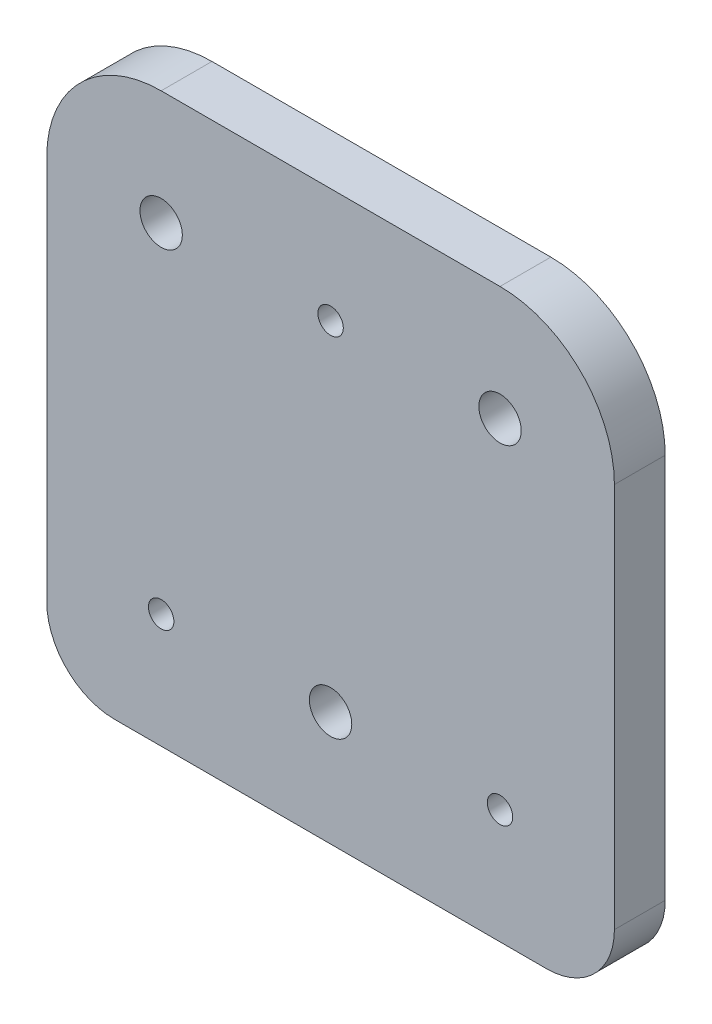
ISO-10303-21;
HEADER;
FILE_DESCRIPTION(('STEP AP214'),'2;1');
FILE_NAME('part.step','',(''),(''),'','','');
FILE_SCHEMA(('AUTOMOTIVE_DESIGN { 1 0 10303 214 1 1 1 1 }'));
ENDSEC;
DATA;
#1=APPLICATION_CONTEXT('core data for automotive mechanical design processes');
#2=APPLICATION_PROTOCOL_DEFINITION('international standard','automotive_design',2000,#1);
#3=PRODUCT_CONTEXT('',#1,'mechanical');
#4=PRODUCT('Part','Part','',(#3));
#5=PRODUCT_RELATED_PRODUCT_CATEGORY('part','',(#4));
#6=PRODUCT_DEFINITION_FORMATION('','',#4);
#7=PRODUCT_DEFINITION_CONTEXT('part definition',#1,'design');
#8=PRODUCT_DEFINITION('design','',#6,#7);
#9=PRODUCT_DEFINITION_SHAPE('','',#8);
#10=(LENGTH_UNIT() NAMED_UNIT(*) SI_UNIT(.MILLI.,.METRE.));
#11=(NAMED_UNIT(*) PLANE_ANGLE_UNIT() SI_UNIT($,.RADIAN.));
#12=(NAMED_UNIT(*) SI_UNIT($,.STERADIAN.) SOLID_ANGLE_UNIT());
#13=UNCERTAINTY_MEASURE_WITH_UNIT(LENGTH_MEASURE(1.E-05),#10,'distance_accuracy_value','');
#14=(GEOMETRIC_REPRESENTATION_CONTEXT(3) GLOBAL_UNCERTAINTY_ASSIGNED_CONTEXT((#13)) GLOBAL_UNIT_ASSIGNED_CONTEXT((#10,
#11,#12)) REPRESENTATION_CONTEXT('',''));
#15=CARTESIAN_POINT('',(0.,0.,0.));
#16=DIRECTION('',(0.,0.,1.));
#17=DIRECTION('',(1.,0.,0.));
#18=AXIS2_PLACEMENT_3D('',#15,#16,#17);
#19=CARTESIAN_POINT('',(20.,20.,6.));
#20=DIRECTION('',(0.,0.,1.));
#21=DIRECTION('',(1.,0.,0.));
#22=AXIS2_PLACEMENT_3D('',#19,#20,#21);
#23=PLANE('',#22);
#24=CARTESIAN_POINT('',(-20.,-20.,6.));
#25=DIRECTION('',(0.,0.,1.));
#26=DIRECTION('',(1.,0.,0.));
#27=AXIS2_PLACEMENT_3D('',#24,#25,#26);
#28=CIRCLE('',#27,1.5);
#29=CARTESIAN_POINT('',(-18.5,-20.,6.));
#30=VERTEX_POINT('',#29);
#31=EDGE_CURVE('E194',#30,#30,#28,.F.);
#32=ORIENTED_EDGE('',*,*,#31,.T.);
#33=EDGE_LOOP('',(#32));
#34=FACE_BOUND('',#33,.T.);
#35=CARTESIAN_POINT('',(20.,-20.,6.));
#36=DIRECTION('',(0.,0.,1.));
#37=DIRECTION('',(1.,0.,0.));
#38=AXIS2_PLACEMENT_3D('',#35,#36,#37);
#39=CIRCLE('',#38,1.5);
#40=CARTESIAN_POINT('',(21.5,-20.,6.));
#41=VERTEX_POINT('',#40);
#42=EDGE_CURVE('E204',#41,#41,#39,.F.);
#43=ORIENTED_EDGE('',*,*,#42,.T.);
#44=EDGE_LOOP('',(#43));
#45=FACE_BOUND('',#44,.T.);
#46=CARTESIAN_POINT('',(0.,20.,6.));
#47=DIRECTION('',(0.,0.,1.));
#48=DIRECTION('',(1.,0.,0.));
#49=AXIS2_PLACEMENT_3D('',#46,#47,#48);
#50=CIRCLE('',#49,1.5);
#51=CARTESIAN_POINT('',(1.5,20.,6.));
#52=VERTEX_POINT('',#51);
#53=EDGE_CURVE('E197',#52,#52,#50,.F.);
#54=ORIENTED_EDGE('',*,*,#53,.T.);
#55=EDGE_LOOP('',(#54));
#56=FACE_BOUND('',#55,.T.);
#57=DIRECTION('',(0.,-1.,0.));
#58=VECTOR('',#57,1.);
#59=CARTESIAN_POINT('',(-33.5,-20.,6.));
#60=LINE('',#59,#58);
#61=CARTESIAN_POINT('',(-33.5,20.,6.));
#62=VERTEX_POINT('',#61);
#63=CARTESIAN_POINT('',(-33.5,-25.5,6.));
#64=VERTEX_POINT('',#63);
#65=EDGE_CURVE('E142',#62,#64,#60,.T.);
#66=ORIENTED_EDGE('',*,*,#65,.T.);
#67=CARTESIAN_POINT('',(-25.5,-25.5,6.));
#68=DIRECTION('',(0.,0.,1.));
#69=DIRECTION('',(1.,0.,0.));
#70=AXIS2_PLACEMENT_3D('',#67,#68,#69);
#71=CIRCLE('',#70,8.);
#72=CARTESIAN_POINT('',(-25.5,-33.5,6.));
#73=VERTEX_POINT('',#72);
#74=EDGE_CURVE('E41',#64,#73,#71,.T.);
#75=ORIENTED_EDGE('',*,*,#74,.T.);
#76=DIRECTION('',(1.,0.,0.));
#77=VECTOR('',#76,1.);
#78=CARTESIAN_POINT('',(20.,-33.5,6.));
#79=LINE('',#78,#77);
#80=CARTESIAN_POINT('',(25.5,-33.5,6.));
#81=VERTEX_POINT('',#80);
#82=EDGE_CURVE('E141',#73,#81,#79,.T.);
#83=ORIENTED_EDGE('',*,*,#82,.T.);
#84=CARTESIAN_POINT('',(25.5,-25.5,6.));
#85=DIRECTION('',(0.,0.,1.));
#86=DIRECTION('',(1.,0.,0.));
#87=AXIS2_PLACEMENT_3D('',#84,#85,#86);
#88=CIRCLE('',#87,8.);
#89=CARTESIAN_POINT('',(33.5,-25.5,6.));
#90=VERTEX_POINT('',#89);
#91=EDGE_CURVE('E48',#81,#90,#88,.T.);
#92=ORIENTED_EDGE('',*,*,#91,.T.);
#93=DIRECTION('',(0.,1.,0.));
#94=VECTOR('',#93,1.);
#95=CARTESIAN_POINT('',(33.5,-20.,6.));
#96=LINE('',#95,#94);
#97=CARTESIAN_POINT('',(33.5,20.,6.));
#98=VERTEX_POINT('',#97);
#99=EDGE_CURVE('E115',#90,#98,#96,.T.);
#100=ORIENTED_EDGE('',*,*,#99,.T.);
#101=CARTESIAN_POINT('',(20.,20.,6.));
#102=DIRECTION('',(0.,0.,1.));
#103=DIRECTION('',(1.,0.,0.));
#104=AXIS2_PLACEMENT_3D('',#101,#102,#103);
#105=CIRCLE('',#104,13.5);
#106=CARTESIAN_POINT('',(20.,33.5,6.));
#107=VERTEX_POINT('',#106);
#108=EDGE_CURVE('E111',#98,#107,#105,.T.);
#109=ORIENTED_EDGE('',*,*,#108,.T.);
#110=DIRECTION('',(-1.,0.,0.));
#111=VECTOR('',#110,1.);
#112=CARTESIAN_POINT('',(-20.,33.5,6.));
#113=LINE('',#112,#111);
#114=CARTESIAN_POINT('',(-20.,33.5,6.));
#115=VERTEX_POINT('',#114);
#116=EDGE_CURVE('E101',#107,#115,#113,.T.);
#117=ORIENTED_EDGE('',*,*,#116,.T.);
#118=CARTESIAN_POINT('',(-20.,20.,6.));
#119=DIRECTION('',(0.,0.,1.));
#120=DIRECTION('',(1.,0.,0.));
#121=AXIS2_PLACEMENT_3D('',#118,#119,#120);
#122=CIRCLE('',#121,13.5);
#123=EDGE_CURVE('E110',#115,#62,#122,.T.);
#124=ORIENTED_EDGE('',*,*,#123,.T.);
#125=EDGE_LOOP('',(#66,#75,#83,#92,#100,#109,#117,#124));
#126=FACE_BOUND('',#125,.T.);
#127=CARTESIAN_POINT('',(20.,20.,6.));
#128=DIRECTION('',(0.,0.,1.));
#129=DIRECTION('',(1.,0.,0.));
#130=AXIS2_PLACEMENT_3D('',#127,#128,#129);
#131=CIRCLE('',#130,2.5);
#132=CARTESIAN_POINT('',(22.5,20.,6.));
#133=VERTEX_POINT('',#132);
#134=EDGE_CURVE('E182',#133,#133,#131,.T.);
#135=ORIENTED_EDGE('',*,*,#134,.F.);
#136=EDGE_LOOP('',(#135));
#137=FACE_BOUND('',#136,.T.);
#138=CARTESIAN_POINT('',(-20.,20.,6.));
#139=DIRECTION('',(0.,0.,1.));
#140=DIRECTION('',(1.,0.,0.));
#141=AXIS2_PLACEMENT_3D('',#138,#139,#140);
#142=CIRCLE('',#141,2.5);
#143=CARTESIAN_POINT('',(-17.5,20.,6.));
#144=VERTEX_POINT('',#143);
#145=EDGE_CURVE('E174',#144,#144,#142,.T.);
#146=ORIENTED_EDGE('',*,*,#145,.F.);
#147=EDGE_LOOP('',(#146));
#148=FACE_BOUND('',#147,.T.);
#149=CARTESIAN_POINT('',(0.,-20.,6.));
#150=DIRECTION('',(0.,0.,1.));
#151=DIRECTION('',(1.,0.,0.));
#152=AXIS2_PLACEMENT_3D('',#149,#150,#151);
#153=CIRCLE('',#152,2.5);
#154=CARTESIAN_POINT('',(2.5,-20.,6.));
#155=VERTEX_POINT('',#154);
#156=EDGE_CURVE('E188',#155,#155,#153,.T.);
#157=ORIENTED_EDGE('',*,*,#156,.F.);
#158=EDGE_LOOP('',(#157));
#159=FACE_BOUND('',#158,.T.);
#160=ADVANCED_FACE('F33',(#34,#45,#56,#126,#137,#148,#159),#23,.T.);
#161=CARTESIAN_POINT('',(20.,20.,0.));
#162=DIRECTION('',(0.,0.,1.));
#163=DIRECTION('',(1.,0.,0.));
#164=AXIS2_PLACEMENT_3D('',#161,#162,#163);
#165=PLANE('',#164);
#166=CARTESIAN_POINT('',(-20.,-20.,0.));
#167=DIRECTION('',(0.,0.,-1.));
#168=DIRECTION('',(-1.,0.,0.));
#169=AXIS2_PLACEMENT_3D('',#166,#167,#168);
#170=CIRCLE('',#169,1.5);
#171=CARTESIAN_POINT('',(-21.5,-20.,0.));
#172=VERTEX_POINT('',#171);
#173=EDGE_CURVE('E207',#172,#172,#170,.T.);
#174=ORIENTED_EDGE('',*,*,#173,.F.);
#175=EDGE_LOOP('',(#174));
#176=FACE_BOUND('',#175,.T.);
#177=CARTESIAN_POINT('',(20.,-20.,0.));
#178=DIRECTION('',(0.,0.,-1.));
#179=DIRECTION('',(-1.,0.,0.));
#180=AXIS2_PLACEMENT_3D('',#177,#178,#179);
#181=CIRCLE('',#180,1.5);
#182=CARTESIAN_POINT('',(18.5,-20.,0.));
#183=VERTEX_POINT('',#182);
#184=EDGE_CURVE('E200',#183,#183,#181,.T.);
#185=ORIENTED_EDGE('',*,*,#184,.F.);
#186=EDGE_LOOP('',(#185));
#187=FACE_BOUND('',#186,.T.);
#188=CARTESIAN_POINT('',(0.,20.,0.));
#189=DIRECTION('',(0.,0.,-1.));
#190=DIRECTION('',(-1.,0.,0.));
#191=AXIS2_PLACEMENT_3D('',#188,#189,#190);
#192=CIRCLE('',#191,1.5);
#193=CARTESIAN_POINT('',(-1.5,20.,0.));
#194=VERTEX_POINT('',#193);
#195=EDGE_CURVE('E201',#194,#194,#192,.T.);
#196=ORIENTED_EDGE('',*,*,#195,.F.);
#197=EDGE_LOOP('',(#196));
#198=FACE_BOUND('',#197,.T.);
#199=DIRECTION('',(1.,0.,0.));
#200=VECTOR('',#199,1.);
#201=CARTESIAN_POINT('',(20.,-33.5,0.));
#202=LINE('',#201,#200);
#203=CARTESIAN_POINT('',(-25.5,-33.5,0.));
#204=VERTEX_POINT('',#203);
#205=CARTESIAN_POINT('',(25.5,-33.5,0.));
#206=VERTEX_POINT('',#205);
#207=EDGE_CURVE('E158',#204,#206,#202,.T.);
#208=ORIENTED_EDGE('',*,*,#207,.F.);
#209=CARTESIAN_POINT('',(-25.5,-25.5,0.));
#210=DIRECTION('',(0.,0.,1.));
#211=DIRECTION('',(1.,0.,0.));
#212=AXIS2_PLACEMENT_3D('',#209,#210,#211);
#213=CIRCLE('',#212,8.);
#214=CARTESIAN_POINT('',(-33.5,-25.5,0.));
#215=VERTEX_POINT('',#214);
#216=EDGE_CURVE('E136',#204,#215,#213,.F.);
#217=ORIENTED_EDGE('',*,*,#216,.T.);
#218=DIRECTION('',(0.,-1.,0.));
#219=VECTOR('',#218,1.);
#220=CARTESIAN_POINT('',(-33.5,-20.,0.));
#221=LINE('',#220,#219);
#222=CARTESIAN_POINT('',(-33.5,20.,0.));
#223=VERTEX_POINT('',#222);
#224=EDGE_CURVE('E157',#223,#215,#221,.T.);
#225=ORIENTED_EDGE('',*,*,#224,.F.);
#226=CARTESIAN_POINT('',(-20.,20.,0.));
#227=DIRECTION('',(0.,0.,1.));
#228=DIRECTION('',(1.,0.,0.));
#229=AXIS2_PLACEMENT_3D('',#226,#227,#228);
#230=CIRCLE('',#229,13.5);
#231=CARTESIAN_POINT('',(-20.,33.5,0.));
#232=VERTEX_POINT('',#231);
#233=EDGE_CURVE('E162',#232,#223,#230,.T.);
#234=ORIENTED_EDGE('',*,*,#233,.F.);
#235=DIRECTION('',(-1.,0.,0.));
#236=VECTOR('',#235,1.);
#237=CARTESIAN_POINT('',(-20.,33.5,0.));
#238=LINE('',#237,#236);
#239=CARTESIAN_POINT('',(20.,33.5,0.));
#240=VERTEX_POINT('',#239);
#241=EDGE_CURVE('E165',#240,#232,#238,.T.);
#242=ORIENTED_EDGE('',*,*,#241,.F.);
#243=CARTESIAN_POINT('',(20.,20.,0.));
#244=DIRECTION('',(0.,0.,1.));
#245=DIRECTION('',(1.,0.,0.));
#246=AXIS2_PLACEMENT_3D('',#243,#244,#245);
#247=CIRCLE('',#246,13.5);
#248=CARTESIAN_POINT('',(33.5,20.,0.));
#249=VERTEX_POINT('',#248);
#250=EDGE_CURVE('E123',#249,#240,#247,.T.);
#251=ORIENTED_EDGE('',*,*,#250,.F.);
#252=DIRECTION('',(0.,1.,0.));
#253=VECTOR('',#252,1.);
#254=CARTESIAN_POINT('',(33.5,-20.,0.));
#255=LINE('',#254,#253);
#256=CARTESIAN_POINT('',(33.5,-25.5,0.));
#257=VERTEX_POINT('',#256);
#258=EDGE_CURVE('E119',#257,#249,#255,.T.);
#259=ORIENTED_EDGE('',*,*,#258,.F.);
#260=CARTESIAN_POINT('',(25.5,-25.5,0.));
#261=DIRECTION('',(0.,0.,1.));
#262=DIRECTION('',(1.,0.,0.));
#263=AXIS2_PLACEMENT_3D('',#260,#261,#262);
#264=CIRCLE('',#263,8.);
#265=EDGE_CURVE('E134',#257,#206,#264,.F.);
#266=ORIENTED_EDGE('',*,*,#265,.T.);
#267=EDGE_LOOP('',(#208,#217,#225,#234,#242,#251,#259,#266));
#268=FACE_BOUND('',#267,.T.);
#269=CARTESIAN_POINT('',(-20.,20.,0.));
#270=DIRECTION('',(0.,0.,1.));
#271=DIRECTION('',(1.,0.,0.));
#272=AXIS2_PLACEMENT_3D('',#269,#270,#271);
#273=CIRCLE('',#272,2.5);
#274=CARTESIAN_POINT('',(-17.5,20.,0.));
#275=VERTEX_POINT('',#274);
#276=EDGE_CURVE('E179',#275,#275,#273,.T.);
#277=ORIENTED_EDGE('',*,*,#276,.T.);
#278=EDGE_LOOP('',(#277));
#279=FACE_BOUND('',#278,.T.);
#280=CARTESIAN_POINT('',(20.,20.,0.));
#281=DIRECTION('',(0.,0.,1.));
#282=DIRECTION('',(1.,0.,0.));
#283=AXIS2_PLACEMENT_3D('',#280,#281,#282);
#284=CIRCLE('',#283,2.5);
#285=CARTESIAN_POINT('',(22.5,20.,0.));
#286=VERTEX_POINT('',#285);
#287=EDGE_CURVE('E185',#286,#286,#284,.T.);
#288=ORIENTED_EDGE('',*,*,#287,.T.);
#289=EDGE_LOOP('',(#288));
#290=FACE_BOUND('',#289,.T.);
#291=CARTESIAN_POINT('',(0.,-20.,0.));
#292=DIRECTION('',(0.,0.,1.));
#293=DIRECTION('',(1.,0.,0.));
#294=AXIS2_PLACEMENT_3D('',#291,#292,#293);
#295=CIRCLE('',#294,2.5);
#296=CARTESIAN_POINT('',(2.5,-20.,0.));
#297=VERTEX_POINT('',#296);
#298=EDGE_CURVE('E191',#297,#297,#295,.T.);
#299=ORIENTED_EDGE('',*,*,#298,.T.);
#300=EDGE_LOOP('',(#299));
#301=FACE_BOUND('',#300,.T.);
#302=ADVANCED_FACE('F154',(#176,#187,#198,#268,#279,#290,#301),#165,.F.);
#303=CARTESIAN_POINT('',(20.,20.,6.));
#304=DIRECTION('',(0.,0.,-1.));
#305=DIRECTION('',(-1.,0.,0.));
#306=AXIS2_PLACEMENT_3D('',#303,#304,#305);
#307=CYLINDRICAL_SURFACE('',#306,13.5);
#308=ORIENTED_EDGE('',*,*,#250,.T.);
#309=DIRECTION('',(0.,0.,-1.));
#310=VECTOR('',#309,1.);
#311=CARTESIAN_POINT('',(20.,33.5,6.));
#312=LINE('',#311,#310);
#313=EDGE_CURVE('E105',#107,#240,#312,.T.);
#314=ORIENTED_EDGE('',*,*,#313,.F.);
#315=ORIENTED_EDGE('',*,*,#108,.F.);
#316=DIRECTION('',(0.,0.,-1.));
#317=VECTOR('',#316,1.);
#318=CARTESIAN_POINT('',(33.5,20.,6.));
#319=LINE('',#318,#317);
#320=EDGE_CURVE('E170',#98,#249,#319,.T.);
#321=ORIENTED_EDGE('',*,*,#320,.T.);
#322=EDGE_LOOP('',(#308,#314,#315,#321));
#323=FACE_BOUND('',#322,.T.);
#324=ADVANCED_FACE('F121',(#323),#307,.T.);
#325=CARTESIAN_POINT('',(-20.,33.5,6.));
#326=DIRECTION('',(0.,-1.,0.));
#327=DIRECTION('',(1.,0.,0.));
#328=AXIS2_PLACEMENT_3D('',#325,#326,#327);
#329=PLANE('',#328);
#330=ORIENTED_EDGE('',*,*,#241,.T.);
#331=DIRECTION('',(0.,0.,-1.));
#332=VECTOR('',#331,1.);
#333=CARTESIAN_POINT('',(-20.,33.5,6.));
#334=LINE('',#333,#332);
#335=EDGE_CURVE('E108',#115,#232,#334,.T.);
#336=ORIENTED_EDGE('',*,*,#335,.F.);
#337=ORIENTED_EDGE('',*,*,#116,.F.);
#338=ORIENTED_EDGE('',*,*,#313,.T.);
#339=EDGE_LOOP('',(#330,#336,#337,#338));
#340=FACE_BOUND('',#339,.T.);
#341=ADVANCED_FACE('F103',(#340),#329,.F.);
#342=CARTESIAN_POINT('',(-20.,20.,6.));
#343=DIRECTION('',(0.,0.,-1.));
#344=DIRECTION('',(-1.,0.,0.));
#345=AXIS2_PLACEMENT_3D('',#342,#343,#344);
#346=CYLINDRICAL_SURFACE('',#345,13.5);
#347=ORIENTED_EDGE('',*,*,#233,.T.);
#348=DIRECTION('',(0.,0.,-1.));
#349=VECTOR('',#348,1.);
#350=CARTESIAN_POINT('',(-33.5,20.,6.));
#351=LINE('',#350,#349);
#352=EDGE_CURVE('E128',#62,#223,#351,.T.);
#353=ORIENTED_EDGE('',*,*,#352,.F.);
#354=ORIENTED_EDGE('',*,*,#123,.F.);
#355=ORIENTED_EDGE('',*,*,#335,.T.);
#356=EDGE_LOOP('',(#347,#353,#354,#355));
#357=FACE_BOUND('',#356,.T.);
#358=ADVANCED_FACE('F176',(#357),#346,.T.);
#359=CARTESIAN_POINT('',(-33.5,-20.,6.));
#360=DIRECTION('',(1.,0.,0.));
#361=DIRECTION('',(0.,0.,-1.));
#362=AXIS2_PLACEMENT_3D('',#359,#360,#361);
#363=PLANE('',#362);
#364=ORIENTED_EDGE('',*,*,#224,.T.);
#365=DIRECTION('',(0.,0.,-1.));
#366=VECTOR('',#365,1.);
#367=CARTESIAN_POINT('',(-33.5,-25.5,6.));
#368=LINE('',#367,#366);
#369=EDGE_CURVE('E56',#215,#64,#368,.F.);
#370=ORIENTED_EDGE('',*,*,#369,.T.);
#371=ORIENTED_EDGE('',*,*,#65,.F.);
#372=ORIENTED_EDGE('',*,*,#352,.T.);
#373=EDGE_LOOP('',(#364,#370,#371,#372));
#374=FACE_BOUND('',#373,.T.);
#375=ADVANCED_FACE('F160',(#374),#363,.F.);
#376=CARTESIAN_POINT('',(20.,-33.5,6.));
#377=DIRECTION('',(0.,1.,0.));
#378=DIRECTION('',(0.,0.,1.));
#379=AXIS2_PLACEMENT_3D('',#376,#377,#378);
#380=PLANE('',#379);
#381=ORIENTED_EDGE('',*,*,#82,.F.);
#382=DIRECTION('',(0.,0.,-1.));
#383=VECTOR('',#382,1.);
#384=CARTESIAN_POINT('',(-25.5,-33.5,6.));
#385=LINE('',#384,#383);
#386=EDGE_CURVE('E126',#73,#204,#385,.T.);
#387=ORIENTED_EDGE('',*,*,#386,.T.);
#388=ORIENTED_EDGE('',*,*,#207,.T.);
#389=DIRECTION('',(0.,0.,-1.));
#390=VECTOR('',#389,1.);
#391=CARTESIAN_POINT('',(25.5,-33.5,6.));
#392=LINE('',#391,#390);
#393=EDGE_CURVE('E124',#206,#81,#392,.F.);
#394=ORIENTED_EDGE('',*,*,#393,.T.);
#395=EDGE_LOOP('',(#381,#387,#388,#394));
#396=FACE_BOUND('',#395,.T.);
#397=ADVANCED_FACE('F146',(#396),#380,.F.);
#398=CARTESIAN_POINT('',(33.5,-20.,6.));
#399=DIRECTION('',(-1.,0.,0.));
#400=DIRECTION('',(0.,-1.,0.));
#401=AXIS2_PLACEMENT_3D('',#398,#399,#400);
#402=PLANE('',#401);
#403=ORIENTED_EDGE('',*,*,#99,.F.);
#404=DIRECTION('',(0.,0.,-1.));
#405=VECTOR('',#404,1.);
#406=CARTESIAN_POINT('',(33.5,-25.5,6.));
#407=LINE('',#406,#405);
#408=EDGE_CURVE('E11',#90,#257,#407,.T.);
#409=ORIENTED_EDGE('',*,*,#408,.T.);
#410=ORIENTED_EDGE('',*,*,#258,.T.);
#411=ORIENTED_EDGE('',*,*,#320,.F.);
#412=EDGE_LOOP('',(#403,#409,#410,#411));
#413=FACE_BOUND('',#412,.T.);
#414=ADVANCED_FACE('F243',(#413),#402,.F.);
#415=CARTESIAN_POINT('',(-20.,20.,6.));
#416=DIRECTION('',(0.,0.,-1.));
#417=DIRECTION('',(-1.,0.,0.));
#418=AXIS2_PLACEMENT_3D('',#415,#416,#417);
#419=CYLINDRICAL_SURFACE('',#418,2.5);
#420=ORIENTED_EDGE('',*,*,#145,.T.);
#421=EDGE_LOOP('',(#420));
#422=FACE_BOUND('',#421,.T.);
#423=ORIENTED_EDGE('',*,*,#276,.F.);
#424=EDGE_LOOP('',(#423));
#425=FACE_BOUND('',#424,.T.);
#426=ADVANCED_FACE('F240',(#422,#425),#419,.F.);
#427=CARTESIAN_POINT('',(20.,20.,6.));
#428=DIRECTION('',(0.,0.,-1.));
#429=DIRECTION('',(-1.,0.,0.));
#430=AXIS2_PLACEMENT_3D('',#427,#428,#429);
#431=CYLINDRICAL_SURFACE('',#430,2.5);
#432=ORIENTED_EDGE('',*,*,#134,.T.);
#433=EDGE_LOOP('',(#432));
#434=FACE_BOUND('',#433,.T.);
#435=ORIENTED_EDGE('',*,*,#287,.F.);
#436=EDGE_LOOP('',(#435));
#437=FACE_BOUND('',#436,.T.);
#438=ADVANCED_FACE('F263',(#434,#437),#431,.F.);
#439=CARTESIAN_POINT('',(0.,-20.,6.));
#440=DIRECTION('',(0.,0.,-1.));
#441=DIRECTION('',(-1.,0.,0.));
#442=AXIS2_PLACEMENT_3D('',#439,#440,#441);
#443=CYLINDRICAL_SURFACE('',#442,2.5);
#444=ORIENTED_EDGE('',*,*,#156,.T.);
#445=EDGE_LOOP('',(#444));
#446=FACE_BOUND('',#445,.T.);
#447=ORIENTED_EDGE('',*,*,#298,.F.);
#448=EDGE_LOOP('',(#447));
#449=FACE_BOUND('',#448,.T.);
#450=ADVANCED_FACE('F257',(#446,#449),#443,.F.);
#451=CARTESIAN_POINT('',(-25.5,-25.5,6.));
#452=DIRECTION('',(0.,0.,-1.));
#453=DIRECTION('',(-1.,0.,0.));
#454=AXIS2_PLACEMENT_3D('',#451,#452,#453);
#455=CYLINDRICAL_SURFACE('',#454,8.);
#456=ORIENTED_EDGE('',*,*,#74,.F.);
#457=ORIENTED_EDGE('',*,*,#369,.F.);
#458=ORIENTED_EDGE('',*,*,#216,.F.);
#459=ORIENTED_EDGE('',*,*,#386,.F.);
#460=EDGE_LOOP('',(#456,#457,#458,#459));
#461=FACE_BOUND('',#460,.T.);
#462=ADVANCED_FACE('F151',(#461),#455,.T.);
#463=CARTESIAN_POINT('',(25.5,-25.5,6.));
#464=DIRECTION('',(0.,0.,-1.));
#465=DIRECTION('',(-1.,0.,0.));
#466=AXIS2_PLACEMENT_3D('',#463,#464,#465);
#467=CYLINDRICAL_SURFACE('',#466,8.);
#468=ORIENTED_EDGE('',*,*,#91,.F.);
#469=ORIENTED_EDGE('',*,*,#393,.F.);
#470=ORIENTED_EDGE('',*,*,#265,.F.);
#471=ORIENTED_EDGE('',*,*,#408,.F.);
#472=EDGE_LOOP('',(#468,#469,#470,#471));
#473=FACE_BOUND('',#472,.T.);
#474=ADVANCED_FACE('F35',(#473),#467,.T.);
#475=CARTESIAN_POINT('',(0.,20.,10.2426406871193));
#476=DIRECTION('',(0.,0.,-1.));
#477=DIRECTION('',(-1.,0.,0.));
#478=AXIS2_PLACEMENT_3D('',#475,#476,#477);
#479=CYLINDRICAL_SURFACE('',#478,1.5);
#480=ORIENTED_EDGE('',*,*,#195,.T.);
#481=EDGE_LOOP('',(#480));
#482=FACE_BOUND('',#481,.T.);
#483=ORIENTED_EDGE('',*,*,#53,.F.);
#484=EDGE_LOOP('',(#483));
#485=FACE_BOUND('',#484,.T.);
#486=ADVANCED_FACE('F225',(#482,#485),#479,.F.);
#487=CARTESIAN_POINT('',(20.,-20.,10.2426406871193));
#488=DIRECTION('',(0.,0.,-1.));
#489=DIRECTION('',(-1.,0.,0.));
#490=AXIS2_PLACEMENT_3D('',#487,#488,#489);
#491=CYLINDRICAL_SURFACE('',#490,1.5);
#492=ORIENTED_EDGE('',*,*,#184,.T.);
#493=EDGE_LOOP('',(#492));
#494=FACE_BOUND('',#493,.T.);
#495=ORIENTED_EDGE('',*,*,#42,.F.);
#496=EDGE_LOOP('',(#495));
#497=FACE_BOUND('',#496,.T.);
#498=ADVANCED_FACE('F228',(#494,#497),#491,.F.);
#499=CARTESIAN_POINT('',(-20.,-20.,10.2426406871193));
#500=DIRECTION('',(0.,0.,-1.));
#501=DIRECTION('',(-1.,0.,0.));
#502=AXIS2_PLACEMENT_3D('',#499,#500,#501);
#503=CYLINDRICAL_SURFACE('',#502,1.5);
#504=ORIENTED_EDGE('',*,*,#173,.T.);
#505=EDGE_LOOP('',(#504));
#506=FACE_BOUND('',#505,.T.);
#507=ORIENTED_EDGE('',*,*,#31,.F.);
#508=EDGE_LOOP('',(#507));
#509=FACE_BOUND('',#508,.T.);
#510=ADVANCED_FACE('F215',(#506,#509),#503,.F.);
#511=CLOSED_SHELL('',(#160,#302,#324,#341,#358,#375,#397,#414,#426,#438,#450,#462,#474,#486,
#498,#510));
#512=MANIFOLD_SOLID_BREP('B2',#511);
#513=ADVANCED_BREP_SHAPE_REPRESENTATION('',(#18,#512),#14);
#514=SHAPE_DEFINITION_REPRESENTATION(#9,#513);
ENDSEC;
END-ISO-10303-21;
